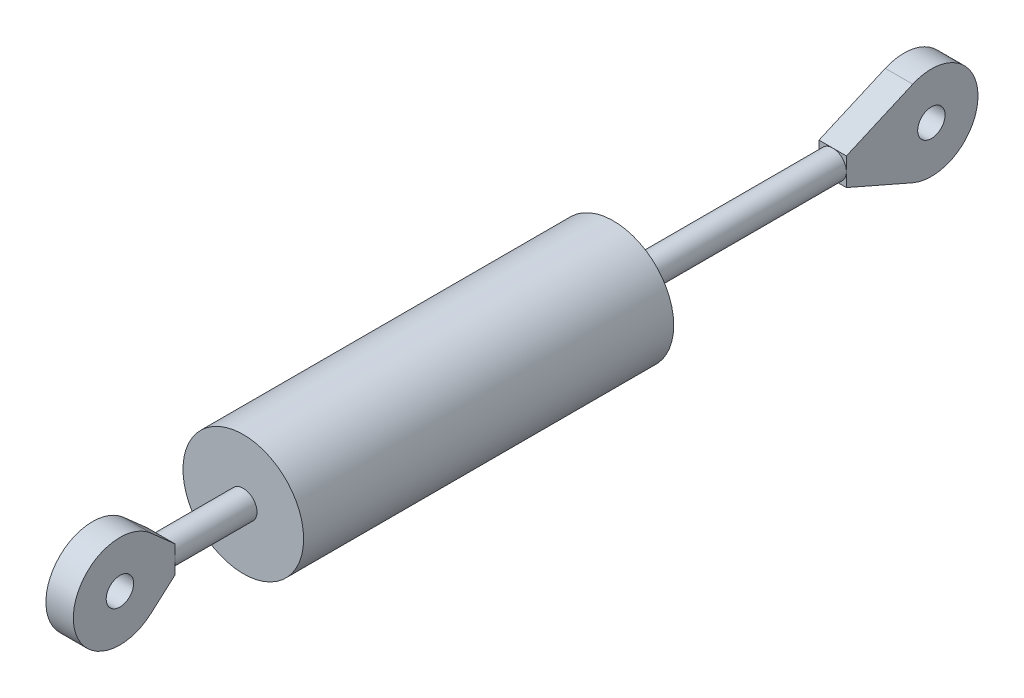
ISO-10303-21;
HEADER;
FILE_DESCRIPTION(('STEP AP214'),'2;1');
FILE_NAME('part.step','',(''),(''),'','','');
FILE_SCHEMA(('AUTOMOTIVE_DESIGN { 1 0 10303 214 1 1 1 1 }'));
ENDSEC;
DATA;
#1=APPLICATION_CONTEXT('core data for automotive mechanical design processes');
#2=APPLICATION_PROTOCOL_DEFINITION('international standard','automotive_design',2000,#1);
#3=PRODUCT_CONTEXT('',#1,'mechanical');
#4=PRODUCT('Part','Part','',(#3));
#5=PRODUCT_RELATED_PRODUCT_CATEGORY('part','',(#4));
#6=PRODUCT_DEFINITION_FORMATION('','',#4);
#7=PRODUCT_DEFINITION_CONTEXT('part definition',#1,'design');
#8=PRODUCT_DEFINITION('design','',#6,#7);
#9=PRODUCT_DEFINITION_SHAPE('','',#8);
#10=(LENGTH_UNIT() NAMED_UNIT(*) SI_UNIT(.MILLI.,.METRE.));
#11=(NAMED_UNIT(*) PLANE_ANGLE_UNIT() SI_UNIT($,.RADIAN.));
#12=(NAMED_UNIT(*) SI_UNIT($,.STERADIAN.) SOLID_ANGLE_UNIT());
#13=UNCERTAINTY_MEASURE_WITH_UNIT(LENGTH_MEASURE(1.E-05),#10,'distance_accuracy_value','');
#14=(GEOMETRIC_REPRESENTATION_CONTEXT(3) GLOBAL_UNCERTAINTY_ASSIGNED_CONTEXT((#13)) GLOBAL_UNIT_ASSIGNED_CONTEXT((#10,
#11,#12)) REPRESENTATION_CONTEXT('',''));
#15=CARTESIAN_POINT('',(0.,0.,0.));
#16=DIRECTION('',(0.,0.,1.));
#17=DIRECTION('',(1.,0.,0.));
#18=AXIS2_PLACEMENT_3D('',#15,#16,#17);
#19=CARTESIAN_POINT('',(0.,11.,34.5921052631579));
#20=DIRECTION('',(0.,0.,-1.));
#21=DIRECTION('',(-1.,0.,0.));
#22=AXIS2_PLACEMENT_3D('',#19,#20,#21);
#23=PLANE('',#22);
#24=CARTESIAN_POINT('',(0.,0.,34.5921052631579));
#25=DIRECTION('',(0.,0.,1.));
#26=DIRECTION('',(1.,0.,0.));
#27=AXIS2_PLACEMENT_3D('',#24,#25,#26);
#28=CIRCLE('',#27,2.5);
#29=CARTESIAN_POINT('',(2.5,0.,34.5921052631579));
#30=VERTEX_POINT('',#29);
#31=EDGE_CURVE('E42',#30,#30,#28,.T.);
#32=ORIENTED_EDGE('',*,*,#31,.F.);
#33=EDGE_LOOP('',(#32));
#34=FACE_BOUND('',#33,.T.);
#35=CARTESIAN_POINT('',(0.,0.,34.5921052631579));
#36=DIRECTION('',(0.,0.,1.));
#37=DIRECTION('',(1.,0.,0.));
#38=AXIS2_PLACEMENT_3D('',#35,#36,#37);
#39=CIRCLE('',#38,11.);
#40=CARTESIAN_POINT('',(11.,0.,34.5921052631579));
#41=VERTEX_POINT('',#40);
#42=EDGE_CURVE('E229',#41,#41,#39,.T.);
#43=ORIENTED_EDGE('',*,*,#42,.T.);
#44=EDGE_LOOP('',(#43));
#45=FACE_BOUND('',#44,.T.);
#46=ADVANCED_FACE('F34',(#34,#45),#23,.F.);
#47=CARTESIAN_POINT('',(0.,11.,-32.9078947368421));
#48=DIRECTION('',(0.,0.,1.));
#49=DIRECTION('',(1.,0.,0.));
#50=AXIS2_PLACEMENT_3D('',#47,#48,#49);
#51=PLANE('',#50);
#52=CARTESIAN_POINT('',(0.,0.,-32.9078947368421));
#53=DIRECTION('',(0.,0.,-1.));
#54=DIRECTION('',(-1.,0.,0.));
#55=AXIS2_PLACEMENT_3D('',#52,#53,#54);
#56=CIRCLE('',#55,2.5);
#57=CARTESIAN_POINT('',(-2.5,0.,-32.9078947368421));
#58=VERTEX_POINT('',#57);
#59=EDGE_CURVE('E11',#58,#58,#56,.T.);
#60=ORIENTED_EDGE('',*,*,#59,.F.);
#61=EDGE_LOOP('',(#60));
#62=FACE_BOUND('',#61,.T.);
#63=CARTESIAN_POINT('',(0.,0.,-32.9078947368421));
#64=DIRECTION('',(0.,0.,1.));
#65=DIRECTION('',(1.,0.,0.));
#66=AXIS2_PLACEMENT_3D('',#63,#64,#65);
#67=CIRCLE('',#66,11.);
#68=CARTESIAN_POINT('',(11.,0.,-32.9078947368421));
#69=VERTEX_POINT('',#68);
#70=EDGE_CURVE('E37',#69,#69,#67,.T.);
#71=ORIENTED_EDGE('',*,*,#70,.F.);
#72=EDGE_LOOP('',(#71));
#73=FACE_BOUND('',#72,.T.);
#74=ADVANCED_FACE('F240',(#62,#73),#51,.F.);
#75=CARTESIAN_POINT('',(0.,0.,34.5921052631579));
#76=DIRECTION('',(0.,0.,1.));
#77=DIRECTION('',(1.,0.,0.));
#78=AXIS2_PLACEMENT_3D('',#75,#76,#77);
#79=CYLINDRICAL_SURFACE('',#78,11.);
#80=ORIENTED_EDGE('',*,*,#42,.F.);
#81=EDGE_LOOP('',(#80));
#82=FACE_BOUND('',#81,.T.);
#83=ORIENTED_EDGE('',*,*,#70,.T.);
#84=EDGE_LOOP('',(#83));
#85=FACE_BOUND('',#84,.T.);
#86=ADVANCED_FACE('F238',(#82,#85),#79,.T.);
#87=CARTESIAN_POINT('',(0.,0.,49.5921052631579));
#88=DIRECTION('',(0.,0.,-1.));
#89=DIRECTION('',(-1.,0.,0.));
#90=AXIS2_PLACEMENT_3D('',#87,#88,#89);
#91=CYLINDRICAL_SURFACE('',#90,2.5);
#92=CARTESIAN_POINT('',(0.,0.,49.5921052631579));
#93=DIRECTION('',(0.,0.,1.));
#94=DIRECTION('',(1.,0.,0.));
#95=AXIS2_PLACEMENT_3D('',#92,#93,#94);
#96=CIRCLE('',#95,2.5);
#97=CARTESIAN_POINT('',(2.5,0.,49.5921052631579));
#98=VERTEX_POINT('',#97);
#99=CARTESIAN_POINT('',(0.,2.5,49.5921052631579));
#100=VERTEX_POINT('',#99);
#101=EDGE_CURVE('E226',#98,#100,#96,.T.);
#102=ORIENTED_EDGE('',*,*,#101,.F.);
#103=CARTESIAN_POINT('',(0.,-2.5,49.5921052631579));
#104=VERTEX_POINT('',#103);
#105=EDGE_CURVE('E217',#104,#98,#96,.T.);
#106=ORIENTED_EDGE('',*,*,#105,.F.);
#107=CARTESIAN_POINT('',(-2.5,0.,49.5921052631579));
#108=VERTEX_POINT('',#107);
#109=EDGE_CURVE('E484',#108,#104,#96,.T.);
#110=ORIENTED_EDGE('',*,*,#109,.F.);
#111=EDGE_CURVE('E230',#100,#108,#96,.T.);
#112=ORIENTED_EDGE('',*,*,#111,.F.);
#113=EDGE_LOOP('',(#102,#106,#110,#112));
#114=FACE_BOUND('',#113,.T.);
#115=ORIENTED_EDGE('',*,*,#31,.T.);
#116=EDGE_LOOP('',(#115));
#117=FACE_BOUND('',#116,.T.);
#118=ADVANCED_FACE('F247',(#114,#117),#91,.T.);
#119=CARTESIAN_POINT('',(-2.5,2.5,49.5921052631579));
#120=DIRECTION('',(0.,0.,-1.));
#121=DIRECTION('',(-1.,0.,0.));
#122=AXIS2_PLACEMENT_3D('',#119,#120,#121);
#123=PLANE('',#122);
#124=DIRECTION('',(0.,1.,0.));
#125=VECTOR('',#124,1.);
#126=CARTESIAN_POINT('',(2.5,2.5,49.5921052631579));
#127=LINE('',#126,#125);
#128=CARTESIAN_POINT('',(2.5,2.5,49.5921052631579));
#129=VERTEX_POINT('',#128);
#130=EDGE_CURVE('E184',#98,#129,#127,.T.);
#131=ORIENTED_EDGE('',*,*,#130,.F.);
#132=ORIENTED_EDGE('',*,*,#101,.T.);
#133=DIRECTION('',(1.,0.,0.));
#134=VECTOR('',#133,1.);
#135=CARTESIAN_POINT('',(-2.5,2.5,49.5921052631579));
#136=LINE('',#135,#134);
#137=EDGE_CURVE('E213',#100,#129,#136,.T.);
#138=ORIENTED_EDGE('',*,*,#137,.T.);
#139=EDGE_LOOP('',(#131,#132,#138));
#140=FACE_BOUND('',#139,.T.);
#141=ADVANCED_FACE('F255',(#140),#123,.T.);
#142=CARTESIAN_POINT('',(-2.5,2.5,49.5921052631579));
#143=VERTEX_POINT('',#142);
#144=EDGE_CURVE('E223',#143,#100,#136,.T.);
#145=ORIENTED_EDGE('',*,*,#144,.T.);
#146=ORIENTED_EDGE('',*,*,#111,.T.);
#147=DIRECTION('',(0.,1.,0.));
#148=VECTOR('',#147,1.);
#149=CARTESIAN_POINT('',(-2.5,2.5,49.5921052631579));
#150=LINE('',#149,#148);
#151=EDGE_CURVE('E200',#108,#143,#150,.T.);
#152=ORIENTED_EDGE('',*,*,#151,.T.);
#153=EDGE_LOOP('',(#145,#146,#152));
#154=FACE_BOUND('',#153,.T.);
#155=ADVANCED_FACE('F395',(#154),#123,.T.);
#156=CARTESIAN_POINT('',(-2.5,-2.5,49.5921052631579));
#157=VERTEX_POINT('',#156);
#158=EDGE_CURVE('E201',#157,#108,#150,.T.);
#159=ORIENTED_EDGE('',*,*,#158,.T.);
#160=ORIENTED_EDGE('',*,*,#109,.T.);
#161=DIRECTION('',(1.,0.,0.));
#162=VECTOR('',#161,1.);
#163=CARTESIAN_POINT('',(-2.5,-2.5,49.5921052631579));
#164=LINE('',#163,#162);
#165=EDGE_CURVE('E214',#157,#104,#164,.T.);
#166=ORIENTED_EDGE('',*,*,#165,.F.);
#167=EDGE_LOOP('',(#159,#160,#166));
#168=FACE_BOUND('',#167,.T.);
#169=ADVANCED_FACE('F261',(#168),#123,.T.);
#170=CARTESIAN_POINT('',(2.5,-2.5,49.5921052631579));
#171=VERTEX_POINT('',#170);
#172=EDGE_CURVE('E218',#104,#171,#164,.T.);
#173=ORIENTED_EDGE('',*,*,#172,.F.);
#174=ORIENTED_EDGE('',*,*,#105,.T.);
#175=EDGE_CURVE('E185',#171,#98,#127,.T.);
#176=ORIENTED_EDGE('',*,*,#175,.F.);
#177=EDGE_LOOP('',(#173,#174,#176));
#178=FACE_BOUND('',#177,.T.);
#179=ADVANCED_FACE('F257',(#178),#123,.T.);
#180=CARTESIAN_POINT('',(-2.5,-2.5,49.5921052631579));
#181=DIRECTION('',(0.,-0.748795472454102,-0.662801131888169));
#182=DIRECTION('',(0.,0.662801131888169,-0.748795472454102));
#183=AXIS2_PLACEMENT_3D('',#180,#181,#182);
#184=PLANE('',#183);
#185=ORIENTED_EDGE('',*,*,#165,.T.);
#186=ORIENTED_EDGE('',*,*,#172,.T.);
#187=DIRECTION('',(0.,0.662801131888169,-0.748795472454102));
#188=VECTOR('',#187,1.);
#189=CARTESIAN_POINT('',(2.5,-2.5,49.5921052631579));
#190=LINE('',#189,#188);
#191=CARTESIAN_POINT('',(2.5,-6.36476151588251,53.9582956421085));
#192=VERTEX_POINT('',#191);
#193=EDGE_CURVE('E194',#192,#171,#190,.T.);
#194=ORIENTED_EDGE('',*,*,#193,.F.);
#195=DIRECTION('',(1.,0.,0.));
#196=VECTOR('',#195,1.);
#197=CARTESIAN_POINT('',(-2.5,-6.36476151588251,53.9582956421085));
#198=LINE('',#197,#196);
#199=CARTESIAN_POINT('',(-2.5,-6.36476151588251,53.9582956421085));
#200=VERTEX_POINT('',#199);
#201=EDGE_CURVE('E219',#200,#192,#198,.T.);
#202=ORIENTED_EDGE('',*,*,#201,.F.);
#203=DIRECTION('',(0.,0.662801131888169,-0.748795472454102));
#204=VECTOR('',#203,1.);
#205=CARTESIAN_POINT('',(-2.5,-2.5,49.5921052631579));
#206=LINE('',#205,#204);
#207=EDGE_CURVE('E210',#200,#157,#206,.T.);
#208=ORIENTED_EDGE('',*,*,#207,.T.);
#209=EDGE_LOOP('',(#185,#186,#194,#202,#208));
#210=FACE_BOUND('',#209,.T.);
#211=ADVANCED_FACE('F260',(#210),#184,.T.);
#212=CARTESIAN_POINT('',(-2.5,-2.26303351058554E-11,59.5921052631579));
#213=DIRECTION('',(1.,0.,0.));
#214=DIRECTION('',(0.,0.,-1.));
#215=AXIS2_PLACEMENT_3D('',#212,#213,#214);
#216=CYLINDRICAL_SURFACE('',#215,8.5);
#217=ORIENTED_EDGE('',*,*,#201,.T.);
#218=CARTESIAN_POINT('',(2.5,-2.26303351058554E-11,59.5921052631579));
#219=DIRECTION('',(1.,0.,0.));
#220=DIRECTION('',(0.,0.,-1.));
#221=AXIS2_PLACEMENT_3D('',#218,#219,#220);
#222=CIRCLE('',#221,8.5);
#223=CARTESIAN_POINT('',(2.5,6.36476151586999,53.9582956421455));
#224=VERTEX_POINT('',#223);
#225=EDGE_CURVE('E191',#224,#192,#222,.T.);
#226=ORIENTED_EDGE('',*,*,#225,.F.);
#227=DIRECTION('',(1.,0.,0.));
#228=VECTOR('',#227,1.);
#229=CARTESIAN_POINT('',(-2.5,6.36476151586999,53.9582956421455));
#230=LINE('',#229,#228);
#231=CARTESIAN_POINT('',(-2.5,6.36476151586999,53.9582956421455));
#232=VERTEX_POINT('',#231);
#233=EDGE_CURVE('E221',#232,#224,#230,.T.);
#234=ORIENTED_EDGE('',*,*,#233,.F.);
#235=CARTESIAN_POINT('',(-2.5,-2.26303351058554E-11,59.5921052631579));
#236=DIRECTION('',(1.,0.,0.));
#237=DIRECTION('',(0.,0.,-1.));
#238=AXIS2_PLACEMENT_3D('',#235,#236,#237);
#239=CIRCLE('',#238,8.5);
#240=EDGE_CURVE('E207',#232,#200,#239,.T.);
#241=ORIENTED_EDGE('',*,*,#240,.T.);
#242=EDGE_LOOP('',(#217,#226,#234,#241));
#243=FACE_BOUND('',#242,.T.);
#244=ADVANCED_FACE('F267',(#243),#216,.T.);
#245=CARTESIAN_POINT('',(-2.5,2.5,49.5921052631579));
#246=DIRECTION('',(0.,0.748795472457954,-0.662801131883817));
#247=DIRECTION('',(0.,0.662801131883817,0.748795472457954));
#248=AXIS2_PLACEMENT_3D('',#245,#246,#247);
#249=PLANE('',#248);
#250=ORIENTED_EDGE('',*,*,#233,.T.);
#251=DIRECTION('',(0.,0.662801131883817,0.748795472457954));
#252=VECTOR('',#251,1.);
#253=CARTESIAN_POINT('',(2.5,2.5,49.5921052631579));
#254=LINE('',#253,#252);
#255=EDGE_CURVE('E188',#129,#224,#254,.T.);
#256=ORIENTED_EDGE('',*,*,#255,.F.);
#257=ORIENTED_EDGE('',*,*,#137,.F.);
#258=ORIENTED_EDGE('',*,*,#144,.F.);
#259=DIRECTION('',(0.,0.662801131883817,0.748795472457954));
#260=VECTOR('',#259,1.);
#261=CARTESIAN_POINT('',(-2.5,2.5,49.5921052631579));
#262=LINE('',#261,#260);
#263=EDGE_CURVE('E204',#143,#232,#262,.T.);
#264=ORIENTED_EDGE('',*,*,#263,.T.);
#265=EDGE_LOOP('',(#250,#256,#257,#258,#264));
#266=FACE_BOUND('',#265,.T.);
#267=ADVANCED_FACE('F263',(#266),#249,.T.);
#268=CARTESIAN_POINT('',(-2.5,-2.26303351058554E-11,59.5921052631579));
#269=DIRECTION('',(1.,0.,0.));
#270=DIRECTION('',(0.,0.,-1.));
#271=AXIS2_PLACEMENT_3D('',#268,#269,#270);
#272=PLANE('',#271);
#273=CARTESIAN_POINT('',(-2.5,-2.26303351058554E-11,59.5921052631579));
#274=DIRECTION('',(1.,0.,0.));
#275=DIRECTION('',(0.,0.,-1.));
#276=AXIS2_PLACEMENT_3D('',#273,#274,#275);
#277=CIRCLE('',#276,2.50000000000663);
#278=CARTESIAN_POINT('',(-2.5,-2.26303351058554E-11,57.0921052631513));
#279=VERTEX_POINT('',#278);
#280=EDGE_CURVE('E197',#279,#279,#277,.T.);
#281=ORIENTED_EDGE('',*,*,#280,.T.);
#282=EDGE_LOOP('',(#281));
#283=FACE_BOUND('',#282,.T.);
#284=ORIENTED_EDGE('',*,*,#158,.F.);
#285=ORIENTED_EDGE('',*,*,#207,.F.);
#286=ORIENTED_EDGE('',*,*,#240,.F.);
#287=ORIENTED_EDGE('',*,*,#263,.F.);
#288=ORIENTED_EDGE('',*,*,#151,.F.);
#289=EDGE_LOOP('',(#284,#285,#286,#287,#288));
#290=FACE_BOUND('',#289,.T.);
#291=ADVANCED_FACE('F266',(#283,#290),#272,.F.);
#292=CARTESIAN_POINT('',(-2.5,-2.26303351058554E-11,59.5921052631579));
#293=DIRECTION('',(1.,0.,0.));
#294=DIRECTION('',(0.,0.,-1.));
#295=AXIS2_PLACEMENT_3D('',#292,#293,#294);
#296=CYLINDRICAL_SURFACE('',#295,2.50000000000663);
#297=ORIENTED_EDGE('',*,*,#280,.F.);
#298=EDGE_LOOP('',(#297));
#299=FACE_BOUND('',#298,.T.);
#300=CARTESIAN_POINT('',(2.5,-2.26303351058554E-11,59.5921052631579));
#301=DIRECTION('',(1.,0.,0.));
#302=DIRECTION('',(0.,0.,-1.));
#303=AXIS2_PLACEMENT_3D('',#300,#301,#302);
#304=CIRCLE('',#303,2.50000000000663);
#305=CARTESIAN_POINT('',(2.5,-2.26303351058554E-11,57.0921052631513));
#306=VERTEX_POINT('',#305);
#307=EDGE_CURVE('E179',#306,#306,#304,.T.);
#308=ORIENTED_EDGE('',*,*,#307,.T.);
#309=EDGE_LOOP('',(#308));
#310=FACE_BOUND('',#309,.T.);
#311=ADVANCED_FACE('F277',(#299,#310),#296,.F.);
#312=CARTESIAN_POINT('',(2.5,-2.26303351058554E-11,59.5921052631579));
#313=DIRECTION('',(1.,0.,0.));
#314=DIRECTION('',(0.,0.,-1.));
#315=AXIS2_PLACEMENT_3D('',#312,#313,#314);
#316=PLANE('',#315);
#317=ORIENTED_EDGE('',*,*,#175,.T.);
#318=ORIENTED_EDGE('',*,*,#130,.T.);
#319=ORIENTED_EDGE('',*,*,#255,.T.);
#320=ORIENTED_EDGE('',*,*,#225,.T.);
#321=ORIENTED_EDGE('',*,*,#193,.T.);
#322=EDGE_LOOP('',(#317,#318,#319,#320,#321));
#323=FACE_BOUND('',#322,.T.);
#324=ORIENTED_EDGE('',*,*,#307,.F.);
#325=EDGE_LOOP('',(#324));
#326=FACE_BOUND('',#325,.T.);
#327=ADVANCED_FACE('F281',(#323,#326),#316,.T.);
#328=CARTESIAN_POINT('',(0.,0.,-72.9078947368421));
#329=DIRECTION('',(0.,0.,1.));
#330=DIRECTION('',(1.,0.,0.));
#331=AXIS2_PLACEMENT_3D('',#328,#329,#330);
#332=CYLINDRICAL_SURFACE('',#331,2.5);
#333=CARTESIAN_POINT('',(0.,0.,-72.9078947368421));
#334=DIRECTION('',(0.,0.,-1.));
#335=DIRECTION('',(-1.,0.,0.));
#336=AXIS2_PLACEMENT_3D('',#333,#334,#335);
#337=CIRCLE('',#336,2.5);
#338=CARTESIAN_POINT('',(-2.5,0.,-72.9078947368421));
#339=VERTEX_POINT('',#338);
#340=CARTESIAN_POINT('',(0.,2.5,-72.9078947368421));
#341=VERTEX_POINT('',#340);
#342=EDGE_CURVE('E177',#339,#341,#337,.T.);
#343=ORIENTED_EDGE('',*,*,#342,.F.);
#344=CARTESIAN_POINT('',(0.,-2.5,-72.9078947368421));
#345=VERTEX_POINT('',#344);
#346=EDGE_CURVE('E50',#345,#339,#337,.T.);
#347=ORIENTED_EDGE('',*,*,#346,.F.);
#348=CARTESIAN_POINT('',(2.5,0.,-72.9078947368421));
#349=VERTEX_POINT('',#348);
#350=EDGE_CURVE('E54',#349,#345,#337,.T.);
#351=ORIENTED_EDGE('',*,*,#350,.F.);
#352=EDGE_CURVE('E180',#341,#349,#337,.T.);
#353=ORIENTED_EDGE('',*,*,#352,.F.);
#354=EDGE_LOOP('',(#343,#347,#351,#353));
#355=FACE_BOUND('',#354,.T.);
#356=ORIENTED_EDGE('',*,*,#59,.T.);
#357=EDGE_LOOP('',(#356));
#358=FACE_BOUND('',#357,.T.);
#359=ADVANCED_FACE('F285',(#355,#358),#332,.T.);
#360=CARTESIAN_POINT('',(-2.5,2.5,-72.9078947368421));
#361=DIRECTION('',(0.,0.,1.));
#362=DIRECTION('',(1.,0.,0.));
#363=AXIS2_PLACEMENT_3D('',#360,#361,#362);
#364=PLANE('',#363);
#365=DIRECTION('',(0.,-1.,0.));
#366=VECTOR('',#365,1.);
#367=CARTESIAN_POINT('',(-2.5,2.5,-72.9078947368421));
#368=LINE('',#367,#366);
#369=CARTESIAN_POINT('',(-2.5,2.5,-72.9078947368421));
#370=VERTEX_POINT('',#369);
#371=EDGE_CURVE('E160',#370,#339,#368,.T.);
#372=ORIENTED_EDGE('',*,*,#371,.T.);
#373=ORIENTED_EDGE('',*,*,#342,.T.);
#374=DIRECTION('',(1.,0.,0.));
#375=VECTOR('',#374,1.);
#376=CARTESIAN_POINT('',(-2.5,2.5,-72.9078947368421));
#377=LINE('',#376,#375);
#378=EDGE_CURVE('E170',#370,#341,#377,.T.);
#379=ORIENTED_EDGE('',*,*,#378,.F.);
#380=EDGE_LOOP('',(#372,#373,#379));
#381=FACE_BOUND('',#380,.T.);
#382=ADVANCED_FACE('F289',(#381),#364,.T.);
#383=CARTESIAN_POINT('',(2.5,2.5,-72.9078947368421));
#384=VERTEX_POINT('',#383);
#385=EDGE_CURVE('E173',#341,#384,#377,.T.);
#386=ORIENTED_EDGE('',*,*,#385,.F.);
#387=ORIENTED_EDGE('',*,*,#352,.T.);
#388=DIRECTION('',(0.,-1.,0.));
#389=VECTOR('',#388,1.);
#390=CARTESIAN_POINT('',(2.5,2.5,-72.9078947368421));
#391=LINE('',#390,#389);
#392=EDGE_CURVE('E133',#384,#349,#391,.T.);
#393=ORIENTED_EDGE('',*,*,#392,.F.);
#394=EDGE_LOOP('',(#386,#387,#393));
#395=FACE_BOUND('',#394,.T.);
#396=ADVANCED_FACE('F345',(#395),#364,.T.);
#397=CARTESIAN_POINT('',(2.5,-2.5,-72.9078947368421));
#398=VERTEX_POINT('',#397);
#399=EDGE_CURVE('E123',#349,#398,#391,.T.);
#400=ORIENTED_EDGE('',*,*,#399,.F.);
#401=ORIENTED_EDGE('',*,*,#350,.T.);
#402=DIRECTION('',(1.,0.,0.));
#403=VECTOR('',#402,1.);
#404=CARTESIAN_POINT('',(-2.5,-2.5,-72.9078947368421));
#405=LINE('',#404,#403);
#406=EDGE_CURVE('E138',#345,#398,#405,.T.);
#407=ORIENTED_EDGE('',*,*,#406,.T.);
#408=EDGE_LOOP('',(#400,#401,#407));
#409=FACE_BOUND('',#408,.T.);
#410=ADVANCED_FACE('F139',(#409),#364,.T.);
#411=CARTESIAN_POINT('',(-2.5,-2.5,-72.9078947368421));
#412=VERTEX_POINT('',#411);
#413=EDGE_CURVE('E143',#412,#345,#405,.T.);
#414=ORIENTED_EDGE('',*,*,#413,.T.);
#415=ORIENTED_EDGE('',*,*,#346,.T.);
#416=EDGE_CURVE('E159',#339,#412,#368,.T.);
#417=ORIENTED_EDGE('',*,*,#416,.T.);
#418=EDGE_LOOP('',(#414,#415,#417));
#419=FACE_BOUND('',#418,.T.);
#420=ADVANCED_FACE('F290',(#419),#364,.T.);
#421=CARTESIAN_POINT('',(-2.5,2.5,-72.9078947368421));
#422=DIRECTION('',(0.,0.916250998490399,0.400604677662838));
#423=DIRECTION('',(0.,-0.400604677662839,0.916250998490399));
#424=AXIS2_PLACEMENT_3D('',#421,#422,#423);
#425=PLANE('',#424);
#426=ORIENTED_EDGE('',*,*,#378,.T.);
#427=ORIENTED_EDGE('',*,*,#385,.T.);
#428=DIRECTION('',(0.,-0.400604677662838,0.916250998490399));
#429=VECTOR('',#428,1.);
#430=CARTESIAN_POINT('',(2.5,2.5,-72.9078947368421));
#431=LINE('',#430,#429);
#432=CARTESIAN_POINT('',(2.5,7.78813348716839,-85.002754976708));
#433=VERTEX_POINT('',#432);
#434=EDGE_CURVE('E151',#433,#384,#431,.T.);
#435=ORIENTED_EDGE('',*,*,#434,.F.);
#436=DIRECTION('',(1.,0.,0.));
#437=VECTOR('',#436,1.);
#438=CARTESIAN_POINT('',(-2.5,7.78813348716839,-85.002754976708));
#439=LINE('',#438,#437);
#440=CARTESIAN_POINT('',(-2.5,7.78813348716839,-85.002754976708));
#441=VERTEX_POINT('',#440);
#442=EDGE_CURVE('E174',#441,#433,#439,.T.);
#443=ORIENTED_EDGE('',*,*,#442,.F.);
#444=DIRECTION('',(0.,-0.400604677662838,0.916250998490399));
#445=VECTOR('',#444,1.);
#446=CARTESIAN_POINT('',(-2.5,2.5,-72.9078947368421));
#447=LINE('',#446,#445);
#448=EDGE_CURVE('E144',#441,#370,#447,.T.);
#449=ORIENTED_EDGE('',*,*,#448,.T.);
#450=EDGE_LOOP('',(#426,#427,#435,#443,#449));
#451=FACE_BOUND('',#450,.T.);
#452=ADVANCED_FACE('F293',(#451),#425,.T.);
#453=CARTESIAN_POINT('',(-2.5,0.,-88.4078947368421));
#454=DIRECTION('',(1.,0.,0.));
#455=DIRECTION('',(0.,0.,-1.));
#456=AXIS2_PLACEMENT_3D('',#453,#454,#455);
#457=CYLINDRICAL_SURFACE('',#456,8.5);
#458=ORIENTED_EDGE('',*,*,#442,.T.);
#459=CARTESIAN_POINT('',(2.5,0.,-88.4078947368421));
#460=DIRECTION('',(1.,0.,0.));
#461=DIRECTION('',(0.,0.,-1.));
#462=AXIS2_PLACEMENT_3D('',#459,#460,#461);
#463=CIRCLE('',#462,8.5);
#464=CARTESIAN_POINT('',(2.5,-7.78813348716839,-85.002754976708));
#465=VERTEX_POINT('',#464);
#466=EDGE_CURVE('E149',#465,#433,#463,.T.);
#467=ORIENTED_EDGE('',*,*,#466,.F.);
#468=DIRECTION('',(1.,0.,0.));
#469=VECTOR('',#468,1.);
#470=CARTESIAN_POINT('',(-2.5,-7.78813348716839,-85.002754976708));
#471=LINE('',#470,#469);
#472=CARTESIAN_POINT('',(-2.5,-7.78813348716839,-85.002754976708));
#473=VERTEX_POINT('',#472);
#474=EDGE_CURVE('E148',#473,#465,#471,.T.);
#475=ORIENTED_EDGE('',*,*,#474,.F.);
#476=CARTESIAN_POINT('',(-2.5,0.,-88.4078947368421));
#477=DIRECTION('',(1.,0.,0.));
#478=DIRECTION('',(0.,0.,-1.));
#479=AXIS2_PLACEMENT_3D('',#476,#477,#478);
#480=CIRCLE('',#479,8.5);
#481=EDGE_CURVE('E165',#473,#441,#480,.T.);
#482=ORIENTED_EDGE('',*,*,#481,.T.);
#483=EDGE_LOOP('',(#458,#467,#475,#482));
#484=FACE_BOUND('',#483,.T.);
#485=ADVANCED_FACE('F298',(#484),#457,.T.);
#486=CARTESIAN_POINT('',(-2.5,-2.5,-72.9078947368421));
#487=DIRECTION('',(0.,-0.916250998490399,0.400604677662838));
#488=DIRECTION('',(0.,-0.400604677662839,-0.916250998490399));
#489=AXIS2_PLACEMENT_3D('',#486,#487,#488);
#490=PLANE('',#489);
#491=ORIENTED_EDGE('',*,*,#474,.T.);
#492=DIRECTION('',(0.,-0.400604677662838,-0.916250998490399));
#493=VECTOR('',#492,1.);
#494=CARTESIAN_POINT('',(2.5,-2.5,-72.9078947368421));
#495=LINE('',#494,#493);
#496=EDGE_CURVE('E129',#398,#465,#495,.T.);
#497=ORIENTED_EDGE('',*,*,#496,.F.);
#498=ORIENTED_EDGE('',*,*,#406,.F.);
#499=ORIENTED_EDGE('',*,*,#413,.F.);
#500=DIRECTION('',(0.,-0.400604677662838,-0.916250998490399));
#501=VECTOR('',#500,1.);
#502=CARTESIAN_POINT('',(-2.5,-2.5,-72.9078947368421));
#503=LINE('',#502,#501);
#504=EDGE_CURVE('E163',#412,#473,#503,.T.);
#505=ORIENTED_EDGE('',*,*,#504,.T.);
#506=EDGE_LOOP('',(#491,#497,#498,#499,#505));
#507=FACE_BOUND('',#506,.T.);
#508=ADVANCED_FACE('F146',(#507),#490,.T.);
#509=CARTESIAN_POINT('',(-2.5,0.,-88.4078947368421));
#510=DIRECTION('',(1.,0.,0.));
#511=DIRECTION('',(0.,0.,-1.));
#512=AXIS2_PLACEMENT_3D('',#509,#510,#511);
#513=PLANE('',#512);
#514=CARTESIAN_POINT('',(-2.5,0.,-88.4078947368421));
#515=DIRECTION('',(1.,0.,0.));
#516=DIRECTION('',(0.,0.,-1.));
#517=AXIS2_PLACEMENT_3D('',#514,#515,#516);
#518=CIRCLE('',#517,2.5);
#519=CARTESIAN_POINT('',(-2.5,0.,-90.9078947368421));
#520=VERTEX_POINT('',#519);
#521=EDGE_CURVE('E156',#520,#520,#518,.T.);
#522=ORIENTED_EDGE('',*,*,#521,.T.);
#523=EDGE_LOOP('',(#522));
#524=FACE_BOUND('',#523,.T.);
#525=ORIENTED_EDGE('',*,*,#371,.F.);
#526=ORIENTED_EDGE('',*,*,#448,.F.);
#527=ORIENTED_EDGE('',*,*,#481,.F.);
#528=ORIENTED_EDGE('',*,*,#504,.F.);
#529=ORIENTED_EDGE('',*,*,#416,.F.);
#530=EDGE_LOOP('',(#525,#526,#527,#528,#529));
#531=FACE_BOUND('',#530,.T.);
#532=ADVANCED_FACE('F297',(#524,#531),#513,.F.);
#533=CARTESIAN_POINT('',(-2.5,0.,-88.4078947368421));
#534=DIRECTION('',(1.,0.,0.));
#535=DIRECTION('',(0.,0.,-1.));
#536=AXIS2_PLACEMENT_3D('',#533,#534,#535);
#537=CYLINDRICAL_SURFACE('',#536,2.5);
#538=ORIENTED_EDGE('',*,*,#521,.F.);
#539=EDGE_LOOP('',(#538));
#540=FACE_BOUND('',#539,.T.);
#541=CARTESIAN_POINT('',(2.5,0.,-88.4078947368421));
#542=DIRECTION('',(1.,0.,0.));
#543=DIRECTION('',(0.,0.,-1.));
#544=AXIS2_PLACEMENT_3D('',#541,#542,#543);
#545=CIRCLE('',#544,2.5);
#546=CARTESIAN_POINT('',(2.5,0.,-90.9078947368421));
#547=VERTEX_POINT('',#546);
#548=EDGE_CURVE('E135',#547,#547,#545,.T.);
#549=ORIENTED_EDGE('',*,*,#548,.T.);
#550=EDGE_LOOP('',(#549));
#551=FACE_BOUND('',#550,.T.);
#552=ADVANCED_FACE('F307',(#540,#551),#537,.F.);
#553=CARTESIAN_POINT('',(2.5,0.,-88.4078947368421));
#554=DIRECTION('',(1.,0.,0.));
#555=DIRECTION('',(0.,0.,-1.));
#556=AXIS2_PLACEMENT_3D('',#553,#554,#555);
#557=PLANE('',#556);
#558=ORIENTED_EDGE('',*,*,#392,.T.);
#559=ORIENTED_EDGE('',*,*,#399,.T.);
#560=ORIENTED_EDGE('',*,*,#496,.T.);
#561=ORIENTED_EDGE('',*,*,#466,.T.);
#562=ORIENTED_EDGE('',*,*,#434,.T.);
#563=EDGE_LOOP('',(#558,#559,#560,#561,#562));
#564=FACE_BOUND('',#563,.T.);
#565=ORIENTED_EDGE('',*,*,#548,.F.);
#566=EDGE_LOOP('',(#565));
#567=FACE_BOUND('',#566,.T.);
#568=ADVANCED_FACE('F125',(#564,#567),#557,.T.);
#569=CLOSED_SHELL('',(#46,#74,#86,#118,#141,#155,#169,#179,#211,#244,#267,#291,#311,#327,#359,
#382,#396,#410,#420,#452,#485,#508,#532,#552,#568));
#570=MANIFOLD_SOLID_BREP('B2',#569);
#571=ADVANCED_BREP_SHAPE_REPRESENTATION('',(#18,#570),#14);
#572=SHAPE_DEFINITION_REPRESENTATION(#9,#571);
ENDSEC;
END-ISO-10303-21;
